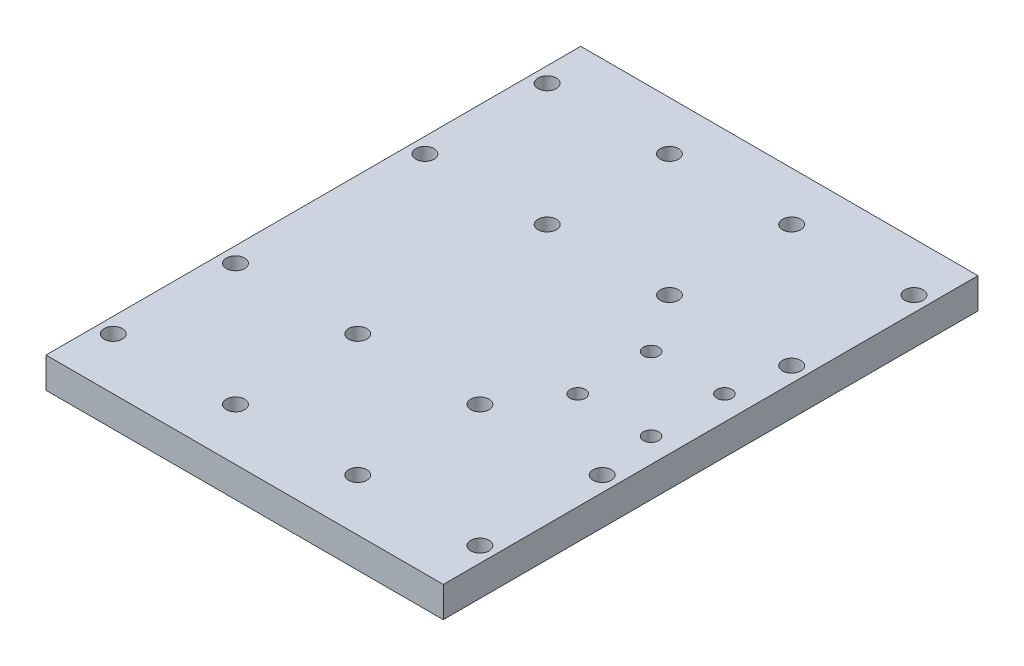
ISO-10303-21;
HEADER;
FILE_DESCRIPTION(('STEP AP214'),'2;1');
FILE_NAME('part.step','',(''),(''),'','','');
FILE_SCHEMA(('AUTOMOTIVE_DESIGN { 1 0 10303 214 1 1 1 1 }'));
ENDSEC;
DATA;
#1=APPLICATION_CONTEXT('core data for automotive mechanical design processes');
#2=APPLICATION_PROTOCOL_DEFINITION('international standard','automotive_design',2000,#1);
#3=PRODUCT_CONTEXT('',#1,'mechanical');
#4=PRODUCT('Part','Part','',(#3));
#5=PRODUCT_RELATED_PRODUCT_CATEGORY('part','',(#4));
#6=PRODUCT_DEFINITION_FORMATION('','',#4);
#7=PRODUCT_DEFINITION_CONTEXT('part definition',#1,'design');
#8=PRODUCT_DEFINITION('design','',#6,#7);
#9=PRODUCT_DEFINITION_SHAPE('','',#8);
#10=(LENGTH_UNIT() NAMED_UNIT(*) SI_UNIT(.MILLI.,.METRE.));
#11=(NAMED_UNIT(*) PLANE_ANGLE_UNIT() SI_UNIT($,.RADIAN.));
#12=(NAMED_UNIT(*) SI_UNIT($,.STERADIAN.) SOLID_ANGLE_UNIT());
#13=UNCERTAINTY_MEASURE_WITH_UNIT(LENGTH_MEASURE(1.E-05),#10,'distance_accuracy_value','');
#14=(GEOMETRIC_REPRESENTATION_CONTEXT(3) GLOBAL_UNCERTAINTY_ASSIGNED_CONTEXT((#13)) GLOBAL_UNIT_ASSIGNED_CONTEXT((#10,
#11,#12)) REPRESENTATION_CONTEXT('',''));
#15=CARTESIAN_POINT('',(0.,0.,0.));
#16=DIRECTION('',(0.,0.,1.));
#17=DIRECTION('',(1.,0.,0.));
#18=AXIS2_PLACEMENT_3D('',#15,#16,#17);
#19=CARTESIAN_POINT('',(130.,10.,0.));
#20=DIRECTION('',(-1.,0.,0.));
#21=DIRECTION('',(0.,0.,1.));
#22=AXIS2_PLACEMENT_3D('',#19,#20,#21);
#23=PLANE('',#22);
#24=DIRECTION('',(0.,0.,-1.));
#25=VECTOR('',#24,1.);
#26=CARTESIAN_POINT('',(130.,0.,0.));
#27=LINE('',#26,#25);
#28=CARTESIAN_POINT('',(130.,0.,131.506875339482));
#29=VERTEX_POINT('',#28);
#30=CARTESIAN_POINT('',(130.,0.,-43.4731246605184));
#31=VERTEX_POINT('',#30);
#32=EDGE_CURVE('E229',#29,#31,#27,.T.);
#33=ORIENTED_EDGE('',*,*,#32,.T.);
#34=DIRECTION('',(0.,-1.,0.));
#35=VECTOR('',#34,1.);
#36=CARTESIAN_POINT('',(130.,10.,-43.4731246605184));
#37=LINE('',#36,#35);
#38=CARTESIAN_POINT('',(130.,10.,-43.4731246605184));
#39=VERTEX_POINT('',#38);
#40=EDGE_CURVE('E91',#39,#31,#37,.T.);
#41=ORIENTED_EDGE('',*,*,#40,.F.);
#42=DIRECTION('',(0.,0.,-1.));
#43=VECTOR('',#42,1.);
#44=CARTESIAN_POINT('',(130.,10.,0.));
#45=LINE('',#44,#43);
#46=CARTESIAN_POINT('',(130.,10.,131.506875339482));
#47=VERTEX_POINT('',#46);
#48=EDGE_CURVE('E47',#47,#39,#45,.T.);
#49=ORIENTED_EDGE('',*,*,#48,.F.);
#50=DIRECTION('',(0.,1.,0.));
#51=VECTOR('',#50,1.);
#52=CARTESIAN_POINT('',(130.,0.,131.506875339482));
#53=LINE('',#52,#51);
#54=EDGE_CURVE('E105',#29,#47,#53,.T.);
#55=ORIENTED_EDGE('',*,*,#54,.F.);
#56=EDGE_LOOP('',(#33,#41,#49,#55));
#57=FACE_BOUND('',#56,.T.);
#58=ADVANCED_FACE('F38',(#57),#23,.F.);
#59=CARTESIAN_POINT('',(0.,10.,0.));
#60=DIRECTION('',(1.,0.,0.));
#61=DIRECTION('',(0.,0.,-1.));
#62=AXIS2_PLACEMENT_3D('',#59,#60,#61);
#63=PLANE('',#62);
#64=DIRECTION('',(0.,0.,1.));
#65=VECTOR('',#64,1.);
#66=CARTESIAN_POINT('',(0.,10.,0.));
#67=LINE('',#66,#65);
#68=CARTESIAN_POINT('',(0.,10.,-43.4731246605184));
#69=VERTEX_POINT('',#68);
#70=CARTESIAN_POINT('',(0.,10.,131.506875339482));
#71=VERTEX_POINT('',#70);
#72=EDGE_CURVE('E11',#69,#71,#67,.T.);
#73=ORIENTED_EDGE('',*,*,#72,.F.);
#74=DIRECTION('',(0.,1.,0.));
#75=VECTOR('',#74,1.);
#76=CARTESIAN_POINT('',(0.,10.,-43.4731246605184));
#77=LINE('',#76,#75);
#78=CARTESIAN_POINT('',(0.,0.,-43.4731246605184));
#79=VERTEX_POINT('',#78);
#80=EDGE_CURVE('E82',#79,#69,#77,.T.);
#81=ORIENTED_EDGE('',*,*,#80,.F.);
#82=DIRECTION('',(0.,0.,1.));
#83=VECTOR('',#82,1.);
#84=CARTESIAN_POINT('',(0.,0.,0.));
#85=LINE('',#84,#83);
#86=CARTESIAN_POINT('',(0.,0.,131.506875339482));
#87=VERTEX_POINT('',#86);
#88=EDGE_CURVE('E42',#79,#87,#85,.T.);
#89=ORIENTED_EDGE('',*,*,#88,.T.);
#90=DIRECTION('',(0.,-1.,0.));
#91=VECTOR('',#90,1.);
#92=CARTESIAN_POINT('',(0.,0.,131.506875339482));
#93=LINE('',#92,#91);
#94=EDGE_CURVE('E84',#71,#87,#93,.T.);
#95=ORIENTED_EDGE('',*,*,#94,.F.);
#96=EDGE_LOOP('',(#73,#81,#89,#95));
#97=FACE_BOUND('',#96,.T.);
#98=ADVANCED_FACE('F80',(#97),#63,.F.);
#99=CARTESIAN_POINT('',(45.,10.,-27.4931246605184));
#100=DIRECTION('',(0.,-1.,0.));
#101=DIRECTION('',(0.,0.,-1.));
#102=AXIS2_PLACEMENT_3D('',#99,#100,#101);
#103=CYLINDRICAL_SURFACE('',#102,3.);
#104=CARTESIAN_POINT('',(45.,10.,-27.4931246605184));
#105=DIRECTION('',(0.,1.,0.));
#106=DIRECTION('',(0.,0.,1.));
#107=AXIS2_PLACEMENT_3D('',#104,#105,#106);
#108=CIRCLE('',#107,3.);
#109=CARTESIAN_POINT('',(45.,10.,-24.4931246605184));
#110=VERTEX_POINT('',#109);
#111=EDGE_CURVE('E179',#110,#110,#108,.T.);
#112=ORIENTED_EDGE('',*,*,#111,.T.);
#113=EDGE_LOOP('',(#112));
#114=FACE_BOUND('',#113,.T.);
#115=CARTESIAN_POINT('',(45.,0.,-27.4931246605184));
#116=DIRECTION('',(0.,1.,0.));
#117=DIRECTION('',(0.,0.,1.));
#118=AXIS2_PLACEMENT_3D('',#115,#116,#117);
#119=CIRCLE('',#118,3.);
#120=CARTESIAN_POINT('',(45.,0.,-24.4931246605184));
#121=VERTEX_POINT('',#120);
#122=EDGE_CURVE('E227',#121,#121,#119,.T.);
#123=ORIENTED_EDGE('',*,*,#122,.F.);
#124=EDGE_LOOP('',(#123));
#125=FACE_BOUND('',#124,.T.);
#126=ADVANCED_FACE('F240',(#114,#125),#103,.F.);
#127=CARTESIAN_POINT('',(45.,10.,12.5068753394816));
#128=DIRECTION('',(0.,-1.,0.));
#129=DIRECTION('',(0.,0.,-1.));
#130=AXIS2_PLACEMENT_3D('',#127,#128,#129);
#131=CYLINDRICAL_SURFACE('',#130,3.);
#132=CARTESIAN_POINT('',(45.,10.,12.5068753394816));
#133=DIRECTION('',(0.,1.,0.));
#134=DIRECTION('',(0.,0.,1.));
#135=AXIS2_PLACEMENT_3D('',#132,#133,#134);
#136=CIRCLE('',#135,3.);
#137=CARTESIAN_POINT('',(45.,10.,15.5068753394816));
#138=VERTEX_POINT('',#137);
#139=EDGE_CURVE('E176',#138,#138,#136,.T.);
#140=ORIENTED_EDGE('',*,*,#139,.T.);
#141=EDGE_LOOP('',(#140));
#142=FACE_BOUND('',#141,.T.);
#143=CARTESIAN_POINT('',(45.,0.,12.5068753394816));
#144=DIRECTION('',(0.,1.,0.));
#145=DIRECTION('',(0.,0.,1.));
#146=AXIS2_PLACEMENT_3D('',#143,#144,#145);
#147=CIRCLE('',#146,3.);
#148=CARTESIAN_POINT('',(45.,0.,15.5068753394816));
#149=VERTEX_POINT('',#148);
#150=EDGE_CURVE('E224',#149,#149,#147,.T.);
#151=ORIENTED_EDGE('',*,*,#150,.F.);
#152=EDGE_LOOP('',(#151));
#153=FACE_BOUND('',#152,.T.);
#154=ADVANCED_FACE('F246',(#142,#153),#131,.F.);
#155=CARTESIAN_POINT('',(5.,10.,12.5068753394816));
#156=DIRECTION('',(0.,-1.,0.));
#157=DIRECTION('',(0.,0.,-1.));
#158=AXIS2_PLACEMENT_3D('',#155,#156,#157);
#159=CYLINDRICAL_SURFACE('',#158,3.);
#160=CARTESIAN_POINT('',(5.,10.,12.5068753394816));
#161=DIRECTION('',(0.,1.,0.));
#162=DIRECTION('',(0.,0.,1.));
#163=AXIS2_PLACEMENT_3D('',#160,#161,#162);
#164=CIRCLE('',#163,3.);
#165=CARTESIAN_POINT('',(5.,10.,15.5068753394816));
#166=VERTEX_POINT('',#165);
#167=EDGE_CURVE('E173',#166,#166,#164,.T.);
#168=ORIENTED_EDGE('',*,*,#167,.T.);
#169=EDGE_LOOP('',(#168));
#170=FACE_BOUND('',#169,.T.);
#171=CARTESIAN_POINT('',(5.,0.,12.5068753394816));
#172=DIRECTION('',(0.,1.,0.));
#173=DIRECTION('',(0.,0.,1.));
#174=AXIS2_PLACEMENT_3D('',#171,#172,#173);
#175=CIRCLE('',#174,3.);
#176=CARTESIAN_POINT('',(5.,0.,15.5068753394816));
#177=VERTEX_POINT('',#176);
#178=EDGE_CURVE('E221',#177,#177,#175,.T.);
#179=ORIENTED_EDGE('',*,*,#178,.F.);
#180=EDGE_LOOP('',(#179));
#181=FACE_BOUND('',#180,.T.);
#182=ADVANCED_FACE('F250',(#170,#181),#159,.F.);
#183=CARTESIAN_POINT('',(85.,10.,-27.4931246605184));
#184=DIRECTION('',(0.,-1.,0.));
#185=DIRECTION('',(0.,0.,-1.));
#186=AXIS2_PLACEMENT_3D('',#183,#184,#185);
#187=CYLINDRICAL_SURFACE('',#186,3.00000000000001);
#188=CARTESIAN_POINT('',(85.,10.,-27.4931246605184));
#189=DIRECTION('',(0.,1.,0.));
#190=DIRECTION('',(0.,0.,1.));
#191=AXIS2_PLACEMENT_3D('',#188,#189,#190);
#192=CIRCLE('',#191,3.00000000000001);
#193=CARTESIAN_POINT('',(85.,10.,-24.4931246605183));
#194=VERTEX_POINT('',#193);
#195=EDGE_CURVE('E170',#194,#194,#192,.T.);
#196=ORIENTED_EDGE('',*,*,#195,.T.);
#197=EDGE_LOOP('',(#196));
#198=FACE_BOUND('',#197,.T.);
#199=CARTESIAN_POINT('',(85.,0.,-27.4931246605184));
#200=DIRECTION('',(0.,1.,0.));
#201=DIRECTION('',(0.,0.,1.));
#202=AXIS2_PLACEMENT_3D('',#199,#200,#201);
#203=CIRCLE('',#202,3.00000000000001);
#204=CARTESIAN_POINT('',(85.,0.,-24.4931246605183));
#205=VERTEX_POINT('',#204);
#206=EDGE_CURVE('E218',#205,#205,#203,.T.);
#207=ORIENTED_EDGE('',*,*,#206,.F.);
#208=EDGE_LOOP('',(#207));
#209=FACE_BOUND('',#208,.T.);
#210=ADVANCED_FACE('F254',(#198,#209),#187,.F.);
#211=CARTESIAN_POINT('',(125.,10.,-27.4931246605184));
#212=DIRECTION('',(0.,-1.,0.));
#213=DIRECTION('',(0.,0.,-1.));
#214=AXIS2_PLACEMENT_3D('',#211,#212,#213);
#215=CYLINDRICAL_SURFACE('',#214,2.99999999999999);
#216=CARTESIAN_POINT('',(125.,10.,-27.4931246605184));
#217=DIRECTION('',(0.,1.,0.));
#218=DIRECTION('',(0.,0.,1.));
#219=AXIS2_PLACEMENT_3D('',#216,#217,#218);
#220=CIRCLE('',#219,2.99999999999999);
#221=CARTESIAN_POINT('',(125.,10.,-24.4931246605184));
#222=VERTEX_POINT('',#221);
#223=EDGE_CURVE('E167',#222,#222,#220,.T.);
#224=ORIENTED_EDGE('',*,*,#223,.T.);
#225=EDGE_LOOP('',(#224));
#226=FACE_BOUND('',#225,.T.);
#227=CARTESIAN_POINT('',(125.,0.,-27.4931246605184));
#228=DIRECTION('',(0.,1.,0.));
#229=DIRECTION('',(0.,0.,1.));
#230=AXIS2_PLACEMENT_3D('',#227,#228,#229);
#231=CIRCLE('',#230,2.99999999999999);
#232=CARTESIAN_POINT('',(125.,0.,-24.4931246605184));
#233=VERTEX_POINT('',#232);
#234=EDGE_CURVE('E215',#233,#233,#231,.T.);
#235=ORIENTED_EDGE('',*,*,#234,.F.);
#236=EDGE_LOOP('',(#235));
#237=FACE_BOUND('',#236,.T.);
#238=ADVANCED_FACE('F258',(#226,#237),#215,.F.);
#239=CARTESIAN_POINT('',(85.,10.,12.5068753394817));
#240=DIRECTION('',(0.,-1.,0.));
#241=DIRECTION('',(0.,0.,-1.));
#242=AXIS2_PLACEMENT_3D('',#239,#240,#241);
#243=CYLINDRICAL_SURFACE('',#242,3.00000000000001);
#244=CARTESIAN_POINT('',(85.,10.,12.5068753394817));
#245=DIRECTION('',(0.,1.,0.));
#246=DIRECTION('',(0.,0.,1.));
#247=AXIS2_PLACEMENT_3D('',#244,#245,#246);
#248=CIRCLE('',#247,3.00000000000001);
#249=CARTESIAN_POINT('',(85.,10.,15.5068753394817));
#250=VERTEX_POINT('',#249);
#251=EDGE_CURVE('E164',#250,#250,#248,.T.);
#252=ORIENTED_EDGE('',*,*,#251,.T.);
#253=EDGE_LOOP('',(#252));
#254=FACE_BOUND('',#253,.T.);
#255=CARTESIAN_POINT('',(85.,0.,12.5068753394817));
#256=DIRECTION('',(0.,1.,0.));
#257=DIRECTION('',(0.,0.,1.));
#258=AXIS2_PLACEMENT_3D('',#255,#256,#257);
#259=CIRCLE('',#258,3.00000000000001);
#260=CARTESIAN_POINT('',(85.,0.,15.5068753394817));
#261=VERTEX_POINT('',#260);
#262=EDGE_CURVE('E212',#261,#261,#259,.T.);
#263=ORIENTED_EDGE('',*,*,#262,.F.);
#264=EDGE_LOOP('',(#263));
#265=FACE_BOUND('',#264,.T.);
#266=ADVANCED_FACE('F262',(#254,#265),#243,.F.);
#267=CARTESIAN_POINT('',(125.,10.,12.5068753394816));
#268=DIRECTION('',(0.,-1.,0.));
#269=DIRECTION('',(0.,0.,-1.));
#270=AXIS2_PLACEMENT_3D('',#267,#268,#269);
#271=CYLINDRICAL_SURFACE('',#270,2.99999999999999);
#272=CARTESIAN_POINT('',(125.,10.,12.5068753394816));
#273=DIRECTION('',(0.,1.,0.));
#274=DIRECTION('',(0.,0.,1.));
#275=AXIS2_PLACEMENT_3D('',#272,#273,#274);
#276=CIRCLE('',#275,2.99999999999999);
#277=CARTESIAN_POINT('',(125.,10.,15.5068753394816));
#278=VERTEX_POINT('',#277);
#279=EDGE_CURVE('E161',#278,#278,#276,.T.);
#280=ORIENTED_EDGE('',*,*,#279,.T.);
#281=EDGE_LOOP('',(#280));
#282=FACE_BOUND('',#281,.T.);
#283=CARTESIAN_POINT('',(125.,0.,12.5068753394816));
#284=DIRECTION('',(0.,1.,0.));
#285=DIRECTION('',(0.,0.,1.));
#286=AXIS2_PLACEMENT_3D('',#283,#284,#285);
#287=CIRCLE('',#286,2.99999999999999);
#288=CARTESIAN_POINT('',(125.,0.,15.5068753394816));
#289=VERTEX_POINT('',#288);
#290=EDGE_CURVE('E209',#289,#289,#287,.T.);
#291=ORIENTED_EDGE('',*,*,#290,.F.);
#292=EDGE_LOOP('',(#291));
#293=FACE_BOUND('',#292,.T.);
#294=ADVANCED_FACE('F266',(#282,#293),#271,.F.);
#295=CARTESIAN_POINT('',(85.,10.,74.5068753394817));
#296=DIRECTION('',(0.,-1.,0.));
#297=DIRECTION('',(0.,0.,-1.));
#298=AXIS2_PLACEMENT_3D('',#295,#296,#297);
#299=CYLINDRICAL_SURFACE('',#298,3.00000000000001);
#300=CARTESIAN_POINT('',(85.,10.,74.5068753394817));
#301=DIRECTION('',(0.,1.,0.));
#302=DIRECTION('',(0.,0.,1.));
#303=AXIS2_PLACEMENT_3D('',#300,#301,#302);
#304=CIRCLE('',#303,3.00000000000001);
#305=CARTESIAN_POINT('',(85.,10.,77.5068753394817));
#306=VERTEX_POINT('',#305);
#307=EDGE_CURVE('E158',#306,#306,#304,.T.);
#308=ORIENTED_EDGE('',*,*,#307,.T.);
#309=EDGE_LOOP('',(#308));
#310=FACE_BOUND('',#309,.T.);
#311=CARTESIAN_POINT('',(85.,0.,74.5068753394817));
#312=DIRECTION('',(0.,1.,0.));
#313=DIRECTION('',(0.,0.,1.));
#314=AXIS2_PLACEMENT_3D('',#311,#312,#313);
#315=CIRCLE('',#314,3.00000000000001);
#316=CARTESIAN_POINT('',(85.,0.,77.5068753394817));
#317=VERTEX_POINT('',#316);
#318=EDGE_CURVE('E206',#317,#317,#315,.T.);
#319=ORIENTED_EDGE('',*,*,#318,.F.);
#320=EDGE_LOOP('',(#319));
#321=FACE_BOUND('',#320,.T.);
#322=ADVANCED_FACE('F270',(#310,#321),#299,.F.);
#323=CARTESIAN_POINT('',(125.,10.,74.5068753394817));
#324=DIRECTION('',(0.,-1.,0.));
#325=DIRECTION('',(0.,0.,-1.));
#326=AXIS2_PLACEMENT_3D('',#323,#324,#325);
#327=CYLINDRICAL_SURFACE('',#326,2.99999999999999);
#328=CARTESIAN_POINT('',(125.,10.,74.5068753394817));
#329=DIRECTION('',(0.,1.,0.));
#330=DIRECTION('',(0.,0.,1.));
#331=AXIS2_PLACEMENT_3D('',#328,#329,#330);
#332=CIRCLE('',#331,2.99999999999999);
#333=CARTESIAN_POINT('',(125.,10.,77.5068753394816));
#334=VERTEX_POINT('',#333);
#335=EDGE_CURVE('E155',#334,#334,#332,.T.);
#336=ORIENTED_EDGE('',*,*,#335,.T.);
#337=EDGE_LOOP('',(#336));
#338=FACE_BOUND('',#337,.T.);
#339=CARTESIAN_POINT('',(125.,0.,74.5068753394817));
#340=DIRECTION('',(0.,1.,0.));
#341=DIRECTION('',(0.,0.,1.));
#342=AXIS2_PLACEMENT_3D('',#339,#340,#341);
#343=CIRCLE('',#342,2.99999999999999);
#344=CARTESIAN_POINT('',(125.,0.,77.5068753394816));
#345=VERTEX_POINT('',#344);
#346=EDGE_CURVE('E203',#345,#345,#343,.T.);
#347=ORIENTED_EDGE('',*,*,#346,.F.);
#348=EDGE_LOOP('',(#347));
#349=FACE_BOUND('',#348,.T.);
#350=ADVANCED_FACE('F274',(#338,#349),#327,.F.);
#351=CARTESIAN_POINT('',(85.,10.,114.506875339482));
#352=DIRECTION('',(0.,-1.,0.));
#353=DIRECTION('',(0.,0.,-1.));
#354=AXIS2_PLACEMENT_3D('',#351,#352,#353);
#355=CYLINDRICAL_SURFACE('',#354,3.00000000000001);
#356=CARTESIAN_POINT('',(85.,10.,114.506875339482));
#357=DIRECTION('',(0.,1.,0.));
#358=DIRECTION('',(0.,0.,1.));
#359=AXIS2_PLACEMENT_3D('',#356,#357,#358);
#360=CIRCLE('',#359,3.00000000000001);
#361=CARTESIAN_POINT('',(85.,10.,117.506875339482));
#362=VERTEX_POINT('',#361);
#363=EDGE_CURVE('E152',#362,#362,#360,.T.);
#364=ORIENTED_EDGE('',*,*,#363,.T.);
#365=EDGE_LOOP('',(#364));
#366=FACE_BOUND('',#365,.T.);
#367=CARTESIAN_POINT('',(85.,0.,114.506875339482));
#368=DIRECTION('',(0.,1.,0.));
#369=DIRECTION('',(0.,0.,1.));
#370=AXIS2_PLACEMENT_3D('',#367,#368,#369);
#371=CIRCLE('',#370,3.00000000000001);
#372=CARTESIAN_POINT('',(85.,0.,117.506875339482));
#373=VERTEX_POINT('',#372);
#374=EDGE_CURVE('E200',#373,#373,#371,.T.);
#375=ORIENTED_EDGE('',*,*,#374,.F.);
#376=EDGE_LOOP('',(#375));
#377=FACE_BOUND('',#376,.T.);
#378=ADVANCED_FACE('F278',(#366,#377),#355,.F.);
#379=CARTESIAN_POINT('',(5.00000000000001,10.,74.5068753394817));
#380=DIRECTION('',(0.,-1.,0.));
#381=DIRECTION('',(0.,0.,-1.));
#382=AXIS2_PLACEMENT_3D('',#379,#380,#381);
#383=CYLINDRICAL_SURFACE('',#382,3.);
#384=CARTESIAN_POINT('',(5.00000000000001,10.,74.5068753394817));
#385=DIRECTION('',(0.,1.,0.));
#386=DIRECTION('',(0.,0.,1.));
#387=AXIS2_PLACEMENT_3D('',#384,#385,#386);
#388=CIRCLE('',#387,3.);
#389=CARTESIAN_POINT('',(5.00000000000001,10.,77.5068753394817));
#390=VERTEX_POINT('',#389);
#391=EDGE_CURVE('E149',#390,#390,#388,.T.);
#392=ORIENTED_EDGE('',*,*,#391,.T.);
#393=EDGE_LOOP('',(#392));
#394=FACE_BOUND('',#393,.T.);
#395=CARTESIAN_POINT('',(5.00000000000001,0.,74.5068753394817));
#396=DIRECTION('',(0.,1.,0.));
#397=DIRECTION('',(0.,0.,1.));
#398=AXIS2_PLACEMENT_3D('',#395,#396,#397);
#399=CIRCLE('',#398,3.);
#400=CARTESIAN_POINT('',(5.00000000000001,0.,77.5068753394817));
#401=VERTEX_POINT('',#400);
#402=EDGE_CURVE('E197',#401,#401,#399,.T.);
#403=ORIENTED_EDGE('',*,*,#402,.F.);
#404=EDGE_LOOP('',(#403));
#405=FACE_BOUND('',#404,.T.);
#406=ADVANCED_FACE('F282',(#394,#405),#383,.F.);
#407=CARTESIAN_POINT('',(5.00000000000001,10.,114.506875339482));
#408=DIRECTION('',(0.,-1.,0.));
#409=DIRECTION('',(0.,0.,-1.));
#410=AXIS2_PLACEMENT_3D('',#407,#408,#409);
#411=CYLINDRICAL_SURFACE('',#410,3.);
#412=CARTESIAN_POINT('',(5.00000000000001,10.,114.506875339482));
#413=DIRECTION('',(0.,1.,0.));
#414=DIRECTION('',(0.,0.,1.));
#415=AXIS2_PLACEMENT_3D('',#412,#413,#414);
#416=CIRCLE('',#415,3.);
#417=CARTESIAN_POINT('',(5.00000000000001,10.,117.506875339482));
#418=VERTEX_POINT('',#417);
#419=EDGE_CURVE('E146',#418,#418,#416,.T.);
#420=ORIENTED_EDGE('',*,*,#419,.T.);
#421=EDGE_LOOP('',(#420));
#422=FACE_BOUND('',#421,.T.);
#423=CARTESIAN_POINT('',(5.00000000000001,0.,114.506875339482));
#424=DIRECTION('',(0.,1.,0.));
#425=DIRECTION('',(0.,0.,1.));
#426=AXIS2_PLACEMENT_3D('',#423,#424,#425);
#427=CIRCLE('',#426,3.);
#428=CARTESIAN_POINT('',(5.00000000000001,0.,117.506875339482));
#429=VERTEX_POINT('',#428);
#430=EDGE_CURVE('E194',#429,#429,#427,.T.);
#431=ORIENTED_EDGE('',*,*,#430,.F.);
#432=EDGE_LOOP('',(#431));
#433=FACE_BOUND('',#432,.T.);
#434=ADVANCED_FACE('F286',(#422,#433),#411,.F.);
#435=CARTESIAN_POINT('',(45.,10.,74.5068753394817));
#436=DIRECTION('',(0.,-1.,0.));
#437=DIRECTION('',(0.,0.,-1.));
#438=AXIS2_PLACEMENT_3D('',#435,#436,#437);
#439=CYLINDRICAL_SURFACE('',#438,3.);
#440=CARTESIAN_POINT('',(45.,10.,74.5068753394817));
#441=DIRECTION('',(0.,1.,0.));
#442=DIRECTION('',(0.,0.,1.));
#443=AXIS2_PLACEMENT_3D('',#440,#441,#442);
#444=CIRCLE('',#443,3.);
#445=CARTESIAN_POINT('',(45.,10.,77.5068753394817));
#446=VERTEX_POINT('',#445);
#447=EDGE_CURVE('E143',#446,#446,#444,.T.);
#448=ORIENTED_EDGE('',*,*,#447,.T.);
#449=EDGE_LOOP('',(#448));
#450=FACE_BOUND('',#449,.T.);
#451=CARTESIAN_POINT('',(45.,0.,74.5068753394817));
#452=DIRECTION('',(0.,1.,0.));
#453=DIRECTION('',(0.,0.,1.));
#454=AXIS2_PLACEMENT_3D('',#451,#452,#453);
#455=CIRCLE('',#454,3.);
#456=CARTESIAN_POINT('',(45.,0.,77.5068753394817));
#457=VERTEX_POINT('',#456);
#458=EDGE_CURVE('E191',#457,#457,#455,.T.);
#459=ORIENTED_EDGE('',*,*,#458,.F.);
#460=EDGE_LOOP('',(#459));
#461=FACE_BOUND('',#460,.T.);
#462=ADVANCED_FACE('F290',(#450,#461),#439,.F.);
#463=CARTESIAN_POINT('',(5.,10.,-27.4931246605184));
#464=DIRECTION('',(0.,-1.,0.));
#465=DIRECTION('',(0.,0.,-1.));
#466=AXIS2_PLACEMENT_3D('',#463,#464,#465);
#467=CYLINDRICAL_SURFACE('',#466,3.);
#468=CARTESIAN_POINT('',(5.,10.,-27.4931246605184));
#469=DIRECTION('',(0.,1.,0.));
#470=DIRECTION('',(0.,0.,1.));
#471=AXIS2_PLACEMENT_3D('',#468,#469,#470);
#472=CIRCLE('',#471,3.);
#473=CARTESIAN_POINT('',(5.,10.,-24.4931246605184));
#474=VERTEX_POINT('',#473);
#475=EDGE_CURVE('E140',#474,#474,#472,.T.);
#476=ORIENTED_EDGE('',*,*,#475,.T.);
#477=EDGE_LOOP('',(#476));
#478=FACE_BOUND('',#477,.T.);
#479=CARTESIAN_POINT('',(5.,0.,-27.4931246605184));
#480=DIRECTION('',(0.,1.,0.));
#481=DIRECTION('',(0.,0.,1.));
#482=AXIS2_PLACEMENT_3D('',#479,#480,#481);
#483=CIRCLE('',#482,3.);
#484=CARTESIAN_POINT('',(5.,0.,-24.4931246605184));
#485=VERTEX_POINT('',#484);
#486=EDGE_CURVE('E188',#485,#485,#483,.T.);
#487=ORIENTED_EDGE('',*,*,#486,.F.);
#488=EDGE_LOOP('',(#487));
#489=FACE_BOUND('',#488,.T.);
#490=ADVANCED_FACE('F294',(#478,#489),#467,.F.);
#491=CARTESIAN_POINT('',(125.,10.,114.506875339482));
#492=DIRECTION('',(0.,-1.,0.));
#493=DIRECTION('',(0.,0.,-1.));
#494=AXIS2_PLACEMENT_3D('',#491,#492,#493);
#495=CYLINDRICAL_SURFACE('',#494,2.99999999999999);
#496=CARTESIAN_POINT('',(125.,10.,114.506875339482));
#497=DIRECTION('',(0.,1.,0.));
#498=DIRECTION('',(0.,0.,1.));
#499=AXIS2_PLACEMENT_3D('',#496,#497,#498);
#500=CIRCLE('',#499,2.99999999999999);
#501=CARTESIAN_POINT('',(125.,10.,117.506875339482));
#502=VERTEX_POINT('',#501);
#503=EDGE_CURVE('E137',#502,#502,#500,.T.);
#504=ORIENTED_EDGE('',*,*,#503,.T.);
#505=EDGE_LOOP('',(#504));
#506=FACE_BOUND('',#505,.T.);
#507=CARTESIAN_POINT('',(125.,0.,114.506875339482));
#508=DIRECTION('',(0.,1.,0.));
#509=DIRECTION('',(0.,0.,1.));
#510=AXIS2_PLACEMENT_3D('',#507,#508,#509);
#511=CIRCLE('',#510,2.99999999999999);
#512=CARTESIAN_POINT('',(125.,0.,117.506875339482));
#513=VERTEX_POINT('',#512);
#514=EDGE_CURVE('E185',#513,#513,#511,.T.);
#515=ORIENTED_EDGE('',*,*,#514,.F.);
#516=EDGE_LOOP('',(#515));
#517=FACE_BOUND('',#516,.T.);
#518=ADVANCED_FACE('F297',(#506,#517),#495,.F.);
#519=CARTESIAN_POINT('',(45.,10.,114.506875339482));
#520=DIRECTION('',(0.,-1.,0.));
#521=DIRECTION('',(0.,0.,-1.));
#522=AXIS2_PLACEMENT_3D('',#519,#520,#521);
#523=CYLINDRICAL_SURFACE('',#522,3.);
#524=CARTESIAN_POINT('',(45.,10.,114.506875339482));
#525=DIRECTION('',(0.,1.,0.));
#526=DIRECTION('',(0.,0.,1.));
#527=AXIS2_PLACEMENT_3D('',#524,#525,#526);
#528=CIRCLE('',#527,3.);
#529=CARTESIAN_POINT('',(45.,10.,117.506875339482));
#530=VERTEX_POINT('',#529);
#531=EDGE_CURVE('E134',#530,#530,#528,.T.);
#532=ORIENTED_EDGE('',*,*,#531,.T.);
#533=EDGE_LOOP('',(#532));
#534=FACE_BOUND('',#533,.T.);
#535=CARTESIAN_POINT('',(45.,0.,114.506875339482));
#536=DIRECTION('',(0.,1.,0.));
#537=DIRECTION('',(0.,0.,1.));
#538=AXIS2_PLACEMENT_3D('',#535,#536,#537);
#539=CIRCLE('',#538,3.);
#540=CARTESIAN_POINT('',(45.,0.,117.506875339482));
#541=VERTEX_POINT('',#540);
#542=EDGE_CURVE('E131',#541,#541,#539,.T.);
#543=ORIENTED_EDGE('',*,*,#542,.F.);
#544=EDGE_LOOP('',(#543));
#545=FACE_BOUND('',#544,.T.);
#546=ADVANCED_FACE('F40',(#534,#545),#523,.F.);
#547=CARTESIAN_POINT('',(0.,10.,0.));
#548=DIRECTION('',(0.,1.,0.));
#549=DIRECTION('',(0.,0.,1.));
#550=AXIS2_PLACEMENT_3D('',#547,#548,#549);
#551=PLANE('',#550);
#552=ORIENTED_EDGE('',*,*,#48,.T.);
#553=DIRECTION('',(1.,0.,0.));
#554=VECTOR('',#553,1.);
#555=CARTESIAN_POINT('',(0.,10.,-43.4731246605184));
#556=LINE('',#555,#554);
#557=EDGE_CURVE('E86',#69,#39,#556,.T.);
#558=ORIENTED_EDGE('',*,*,#557,.F.);
#559=ORIENTED_EDGE('',*,*,#72,.T.);
#560=DIRECTION('',(-1.,0.,0.));
#561=VECTOR('',#560,1.);
#562=CARTESIAN_POINT('',(0.,10.,131.506875339482));
#563=LINE('',#562,#561);
#564=EDGE_CURVE('E107',#47,#71,#563,.T.);
#565=ORIENTED_EDGE('',*,*,#564,.F.);
#566=EDGE_LOOP('',(#552,#558,#559,#565));
#567=FACE_BOUND('',#566,.T.);
#568=CARTESIAN_POINT('',(122.,10.,31.5068753394816));
#569=DIRECTION('',(0.,1.,0.));
#570=DIRECTION('',(0.,0.,1.));
#571=AXIS2_PLACEMENT_3D('',#568,#569,#570);
#572=CIRCLE('',#571,2.5);
#573=CARTESIAN_POINT('',(122.,10.,34.0068753394816));
#574=VERTEX_POINT('',#573);
#575=EDGE_CURVE('E109',#574,#574,#572,.T.);
#576=ORIENTED_EDGE('',*,*,#575,.F.);
#577=EDGE_LOOP('',(#576));
#578=FACE_BOUND('',#577,.T.);
#579=CARTESIAN_POINT('',(122.,10.,55.5068753394816));
#580=DIRECTION('',(0.,1.,0.));
#581=DIRECTION('',(0.,0.,1.));
#582=AXIS2_PLACEMENT_3D('',#579,#580,#581);
#583=CIRCLE('',#582,2.5);
#584=CARTESIAN_POINT('',(122.,10.,58.0068753394816));
#585=VERTEX_POINT('',#584);
#586=EDGE_CURVE('E113',#585,#585,#583,.T.);
#587=ORIENTED_EDGE('',*,*,#586,.F.);
#588=EDGE_LOOP('',(#587));
#589=FACE_BOUND('',#588,.T.);
#590=CARTESIAN_POINT('',(98.,10.,55.5068753394816));
#591=DIRECTION('',(0.,1.,0.));
#592=DIRECTION('',(0.,0.,1.));
#593=AXIS2_PLACEMENT_3D('',#590,#591,#592);
#594=CIRCLE('',#593,2.5);
#595=CARTESIAN_POINT('',(98.,10.,58.0068753394816));
#596=VERTEX_POINT('',#595);
#597=EDGE_CURVE('E119',#596,#596,#594,.T.);
#598=ORIENTED_EDGE('',*,*,#597,.F.);
#599=EDGE_LOOP('',(#598));
#600=FACE_BOUND('',#599,.T.);
#601=CARTESIAN_POINT('',(98.,10.,31.5068753394816));
#602=DIRECTION('',(0.,1.,0.));
#603=DIRECTION('',(0.,0.,1.));
#604=AXIS2_PLACEMENT_3D('',#601,#602,#603);
#605=CIRCLE('',#604,2.5);
#606=CARTESIAN_POINT('',(98.,10.,34.0068753394816));
#607=VERTEX_POINT('',#606);
#608=EDGE_CURVE('E125',#607,#607,#605,.T.);
#609=ORIENTED_EDGE('',*,*,#608,.F.);
#610=EDGE_LOOP('',(#609));
#611=FACE_BOUND('',#610,.T.);
#612=ORIENTED_EDGE('',*,*,#531,.F.);
#613=EDGE_LOOP('',(#612));
#614=FACE_BOUND('',#613,.T.);
#615=ORIENTED_EDGE('',*,*,#503,.F.);
#616=EDGE_LOOP('',(#615));
#617=FACE_BOUND('',#616,.T.);
#618=ORIENTED_EDGE('',*,*,#475,.F.);
#619=EDGE_LOOP('',(#618));
#620=FACE_BOUND('',#619,.T.);
#621=ORIENTED_EDGE('',*,*,#447,.F.);
#622=EDGE_LOOP('',(#621));
#623=FACE_BOUND('',#622,.T.);
#624=ORIENTED_EDGE('',*,*,#419,.F.);
#625=EDGE_LOOP('',(#624));
#626=FACE_BOUND('',#625,.T.);
#627=ORIENTED_EDGE('',*,*,#391,.F.);
#628=EDGE_LOOP('',(#627));
#629=FACE_BOUND('',#628,.T.);
#630=ORIENTED_EDGE('',*,*,#363,.F.);
#631=EDGE_LOOP('',(#630));
#632=FACE_BOUND('',#631,.T.);
#633=ORIENTED_EDGE('',*,*,#335,.F.);
#634=EDGE_LOOP('',(#633));
#635=FACE_BOUND('',#634,.T.);
#636=ORIENTED_EDGE('',*,*,#307,.F.);
#637=EDGE_LOOP('',(#636));
#638=FACE_BOUND('',#637,.T.);
#639=ORIENTED_EDGE('',*,*,#279,.F.);
#640=EDGE_LOOP('',(#639));
#641=FACE_BOUND('',#640,.T.);
#642=ORIENTED_EDGE('',*,*,#251,.F.);
#643=EDGE_LOOP('',(#642));
#644=FACE_BOUND('',#643,.T.);
#645=ORIENTED_EDGE('',*,*,#223,.F.);
#646=EDGE_LOOP('',(#645));
#647=FACE_BOUND('',#646,.T.);
#648=ORIENTED_EDGE('',*,*,#195,.F.);
#649=EDGE_LOOP('',(#648));
#650=FACE_BOUND('',#649,.T.);
#651=ORIENTED_EDGE('',*,*,#167,.F.);
#652=EDGE_LOOP('',(#651));
#653=FACE_BOUND('',#652,.T.);
#654=ORIENTED_EDGE('',*,*,#139,.F.);
#655=EDGE_LOOP('',(#654));
#656=FACE_BOUND('',#655,.T.);
#657=ORIENTED_EDGE('',*,*,#111,.F.);
#658=EDGE_LOOP('',(#657));
#659=FACE_BOUND('',#658,.T.);
#660=ADVANCED_FACE('F87',(#567,#578,#589,#600,#611,#614,#617,#620,#623,#626,#629,#632,#635,#638,
#641,#644,#647,#650,#653,#656,#659),#551,.T.);
#661=CARTESIAN_POINT('',(0.,0.,0.));
#662=DIRECTION('',(0.,1.,0.));
#663=DIRECTION('',(0.,0.,1.));
#664=AXIS2_PLACEMENT_3D('',#661,#662,#663);
#665=PLANE('',#664);
#666=CARTESIAN_POINT('',(122.,0.,31.5068753394816));
#667=DIRECTION('',(0.,1.,0.));
#668=DIRECTION('',(0.,0.,1.));
#669=AXIS2_PLACEMENT_3D('',#666,#667,#668);
#670=CIRCLE('',#669,2.5);
#671=CARTESIAN_POINT('',(122.,0.,34.0068753394816));
#672=VERTEX_POINT('',#671);
#673=EDGE_CURVE('E110',#672,#672,#670,.T.);
#674=ORIENTED_EDGE('',*,*,#673,.T.);
#675=EDGE_LOOP('',(#674));
#676=FACE_BOUND('',#675,.T.);
#677=CARTESIAN_POINT('',(122.,0.,55.5068753394816));
#678=DIRECTION('',(0.,1.,0.));
#679=DIRECTION('',(0.,0.,1.));
#680=AXIS2_PLACEMENT_3D('',#677,#678,#679);
#681=CIRCLE('',#680,2.5);
#682=CARTESIAN_POINT('',(122.,0.,58.0068753394816));
#683=VERTEX_POINT('',#682);
#684=EDGE_CURVE('E116',#683,#683,#681,.T.);
#685=ORIENTED_EDGE('',*,*,#684,.T.);
#686=EDGE_LOOP('',(#685));
#687=FACE_BOUND('',#686,.T.);
#688=CARTESIAN_POINT('',(98.,0.,55.5068753394816));
#689=DIRECTION('',(0.,1.,0.));
#690=DIRECTION('',(0.,0.,1.));
#691=AXIS2_PLACEMENT_3D('',#688,#689,#690);
#692=CIRCLE('',#691,2.5);
#693=CARTESIAN_POINT('',(98.,0.,58.0068753394816));
#694=VERTEX_POINT('',#693);
#695=EDGE_CURVE('E122',#694,#694,#692,.T.);
#696=ORIENTED_EDGE('',*,*,#695,.T.);
#697=EDGE_LOOP('',(#696));
#698=FACE_BOUND('',#697,.T.);
#699=CARTESIAN_POINT('',(98.,0.,31.5068753394816));
#700=DIRECTION('',(0.,1.,0.));
#701=DIRECTION('',(0.,0.,1.));
#702=AXIS2_PLACEMENT_3D('',#699,#700,#701);
#703=CIRCLE('',#702,2.5);
#704=CARTESIAN_POINT('',(98.,0.,34.0068753394816));
#705=VERTEX_POINT('',#704);
#706=EDGE_CURVE('E128',#705,#705,#703,.T.);
#707=ORIENTED_EDGE('',*,*,#706,.T.);
#708=EDGE_LOOP('',(#707));
#709=FACE_BOUND('',#708,.T.);
#710=ORIENTED_EDGE('',*,*,#542,.T.);
#711=EDGE_LOOP('',(#710));
#712=FACE_BOUND('',#711,.T.);
#713=ORIENTED_EDGE('',*,*,#514,.T.);
#714=EDGE_LOOP('',(#713));
#715=FACE_BOUND('',#714,.T.);
#716=ORIENTED_EDGE('',*,*,#486,.T.);
#717=EDGE_LOOP('',(#716));
#718=FACE_BOUND('',#717,.T.);
#719=ORIENTED_EDGE('',*,*,#458,.T.);
#720=EDGE_LOOP('',(#719));
#721=FACE_BOUND('',#720,.T.);
#722=ORIENTED_EDGE('',*,*,#430,.T.);
#723=EDGE_LOOP('',(#722));
#724=FACE_BOUND('',#723,.T.);
#725=ORIENTED_EDGE('',*,*,#402,.T.);
#726=EDGE_LOOP('',(#725));
#727=FACE_BOUND('',#726,.T.);
#728=ORIENTED_EDGE('',*,*,#374,.T.);
#729=EDGE_LOOP('',(#728));
#730=FACE_BOUND('',#729,.T.);
#731=ORIENTED_EDGE('',*,*,#346,.T.);
#732=EDGE_LOOP('',(#731));
#733=FACE_BOUND('',#732,.T.);
#734=ORIENTED_EDGE('',*,*,#318,.T.);
#735=EDGE_LOOP('',(#734));
#736=FACE_BOUND('',#735,.T.);
#737=ORIENTED_EDGE('',*,*,#290,.T.);
#738=EDGE_LOOP('',(#737));
#739=FACE_BOUND('',#738,.T.);
#740=ORIENTED_EDGE('',*,*,#262,.T.);
#741=EDGE_LOOP('',(#740));
#742=FACE_BOUND('',#741,.T.);
#743=ORIENTED_EDGE('',*,*,#234,.T.);
#744=EDGE_LOOP('',(#743));
#745=FACE_BOUND('',#744,.T.);
#746=ORIENTED_EDGE('',*,*,#206,.T.);
#747=EDGE_LOOP('',(#746));
#748=FACE_BOUND('',#747,.T.);
#749=ORIENTED_EDGE('',*,*,#178,.T.);
#750=EDGE_LOOP('',(#749));
#751=FACE_BOUND('',#750,.T.);
#752=ORIENTED_EDGE('',*,*,#150,.T.);
#753=EDGE_LOOP('',(#752));
#754=FACE_BOUND('',#753,.T.);
#755=ORIENTED_EDGE('',*,*,#122,.T.);
#756=EDGE_LOOP('',(#755));
#757=FACE_BOUND('',#756,.T.);
#758=ORIENTED_EDGE('',*,*,#88,.F.);
#759=DIRECTION('',(-1.,0.,0.));
#760=VECTOR('',#759,1.);
#761=CARTESIAN_POINT('',(0.,0.,-43.4731246605184));
#762=LINE('',#761,#760);
#763=EDGE_CURVE('E96',#31,#79,#762,.T.);
#764=ORIENTED_EDGE('',*,*,#763,.F.);
#765=ORIENTED_EDGE('',*,*,#32,.F.);
#766=DIRECTION('',(1.,0.,0.));
#767=VECTOR('',#766,1.);
#768=CARTESIAN_POINT('',(0.,0.,131.506875339482));
#769=LINE('',#768,#767);
#770=EDGE_CURVE('E102',#87,#29,#769,.T.);
#771=ORIENTED_EDGE('',*,*,#770,.F.);
#772=EDGE_LOOP('',(#758,#764,#765,#771));
#773=FACE_BOUND('',#772,.T.);
#774=ADVANCED_FACE('F232',(#676,#687,#698,#709,#712,#715,#718,#721,#724,#727,#730,#733,#736,
#739,#742,#745,#748,#751,#754,#757,#773),#665,.F.);
#775=CARTESIAN_POINT('',(98.,0.,31.5068753394816));
#776=DIRECTION('',(0.,1.,0.));
#777=DIRECTION('',(0.,0.,1.));
#778=AXIS2_PLACEMENT_3D('',#775,#776,#777);
#779=CYLINDRICAL_SURFACE('',#778,2.5);
#780=ORIENTED_EDGE('',*,*,#706,.F.);
#781=EDGE_LOOP('',(#780));
#782=FACE_BOUND('',#781,.T.);
#783=ORIENTED_EDGE('',*,*,#608,.T.);
#784=EDGE_LOOP('',(#783));
#785=FACE_BOUND('',#784,.T.);
#786=ADVANCED_FACE('F311',(#782,#785),#779,.F.);
#787=CARTESIAN_POINT('',(98.,0.,55.5068753394816));
#788=DIRECTION('',(0.,1.,0.));
#789=DIRECTION('',(0.,0.,1.));
#790=AXIS2_PLACEMENT_3D('',#787,#788,#789);
#791=CYLINDRICAL_SURFACE('',#790,2.5);
#792=ORIENTED_EDGE('',*,*,#695,.F.);
#793=EDGE_LOOP('',(#792));
#794=FACE_BOUND('',#793,.T.);
#795=ORIENTED_EDGE('',*,*,#597,.T.);
#796=EDGE_LOOP('',(#795));
#797=FACE_BOUND('',#796,.T.);
#798=ADVANCED_FACE('F358',(#794,#797),#791,.F.);
#799=CARTESIAN_POINT('',(122.,0.,55.5068753394816));
#800=DIRECTION('',(0.,1.,0.));
#801=DIRECTION('',(0.,0.,1.));
#802=AXIS2_PLACEMENT_3D('',#799,#800,#801);
#803=CYLINDRICAL_SURFACE('',#802,2.5);
#804=ORIENTED_EDGE('',*,*,#684,.F.);
#805=EDGE_LOOP('',(#804));
#806=FACE_BOUND('',#805,.T.);
#807=ORIENTED_EDGE('',*,*,#586,.T.);
#808=EDGE_LOOP('',(#807));
#809=FACE_BOUND('',#808,.T.);
#810=ADVANCED_FACE('F366',(#806,#809),#803,.F.);
#811=CARTESIAN_POINT('',(122.,0.,31.5068753394816));
#812=DIRECTION('',(0.,1.,0.));
#813=DIRECTION('',(0.,0.,1.));
#814=AXIS2_PLACEMENT_3D('',#811,#812,#813);
#815=CYLINDRICAL_SURFACE('',#814,2.5);
#816=ORIENTED_EDGE('',*,*,#673,.F.);
#817=EDGE_LOOP('',(#816));
#818=FACE_BOUND('',#817,.T.);
#819=ORIENTED_EDGE('',*,*,#575,.T.);
#820=EDGE_LOOP('',(#819));
#821=FACE_BOUND('',#820,.T.);
#822=ADVANCED_FACE('F370',(#818,#821),#815,.F.);
#823=CARTESIAN_POINT('',(0.,0.,131.506875339482));
#824=DIRECTION('',(0.,0.,-1.));
#825=DIRECTION('',(-1.,0.,0.));
#826=AXIS2_PLACEMENT_3D('',#823,#824,#825);
#827=PLANE('',#826);
#828=ORIENTED_EDGE('',*,*,#94,.T.);
#829=ORIENTED_EDGE('',*,*,#770,.T.);
#830=ORIENTED_EDGE('',*,*,#54,.T.);
#831=ORIENTED_EDGE('',*,*,#564,.T.);
#832=EDGE_LOOP('',(#828,#829,#830,#831));
#833=FACE_BOUND('',#832,.T.);
#834=ADVANCED_FACE('F234',(#833),#827,.F.);
#835=CARTESIAN_POINT('',(0.,0.,-43.4731246605184));
#836=DIRECTION('',(0.,0.,1.));
#837=DIRECTION('',(1.,0.,0.));
#838=AXIS2_PLACEMENT_3D('',#835,#836,#837);
#839=PLANE('',#838);
#840=ORIENTED_EDGE('',*,*,#80,.T.);
#841=ORIENTED_EDGE('',*,*,#557,.T.);
#842=ORIENTED_EDGE('',*,*,#40,.T.);
#843=ORIENTED_EDGE('',*,*,#763,.T.);
#844=EDGE_LOOP('',(#840,#841,#842,#843));
#845=FACE_BOUND('',#844,.T.);
#846=ADVANCED_FACE('F94',(#845),#839,.F.);
#847=CLOSED_SHELL('',(#58,#98,#126,#154,#182,#210,#238,#266,#294,#322,#350,#378,#406,#434,#462,
#490,#518,#546,#660,#774,#786,#798,#810,#822,#834,#846));
#848=MANIFOLD_SOLID_BREP('B2',#847);
#849=ADVANCED_BREP_SHAPE_REPRESENTATION('',(#18,#848),#14);
#850=SHAPE_DEFINITION_REPRESENTATION(#9,#849);
ENDSEC;
END-ISO-10303-21;
